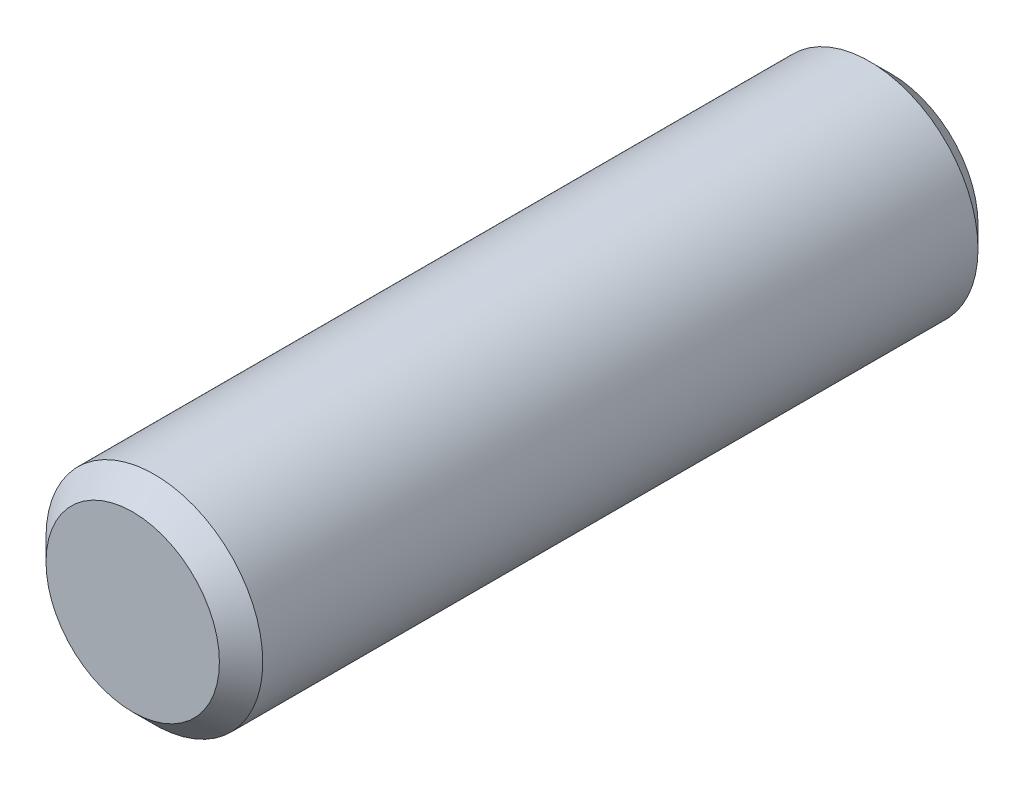
ISO-10303-21;
HEADER;
FILE_DESCRIPTION(('STEP AP214'),'2;1');
FILE_NAME('part.step','',(''),(''),'','','');
FILE_SCHEMA(('AUTOMOTIVE_DESIGN { 1 0 10303 214 1 1 1 1 }'));
ENDSEC;
DATA;
#1=APPLICATION_CONTEXT('core data for automotive mechanical design processes');
#2=APPLICATION_PROTOCOL_DEFINITION('international standard','automotive_design',2000,#1);
#3=PRODUCT_CONTEXT('',#1,'mechanical');
#4=PRODUCT('Part','Part','',(#3));
#5=PRODUCT_RELATED_PRODUCT_CATEGORY('part','',(#4));
#6=PRODUCT_DEFINITION_FORMATION('','',#4);
#7=PRODUCT_DEFINITION_CONTEXT('part definition',#1,'design');
#8=PRODUCT_DEFINITION('design','',#6,#7);
#9=PRODUCT_DEFINITION_SHAPE('','',#8);
#10=(LENGTH_UNIT() NAMED_UNIT(*) SI_UNIT(.MILLI.,.METRE.));
#11=(NAMED_UNIT(*) PLANE_ANGLE_UNIT() SI_UNIT($,.RADIAN.));
#12=(NAMED_UNIT(*) SI_UNIT($,.STERADIAN.) SOLID_ANGLE_UNIT());
#13=UNCERTAINTY_MEASURE_WITH_UNIT(LENGTH_MEASURE(1.E-05),#10,'distance_accuracy_value','');
#14=(GEOMETRIC_REPRESENTATION_CONTEXT(3) GLOBAL_UNCERTAINTY_ASSIGNED_CONTEXT((#13)) GLOBAL_UNIT_ASSIGNED_CONTEXT((#10,
#11,#12)) REPRESENTATION_CONTEXT('',''));
#15=CARTESIAN_POINT('',(0.,0.,0.));
#16=DIRECTION('',(0.,0.,1.));
#17=DIRECTION('',(1.,0.,0.));
#18=AXIS2_PLACEMENT_3D('',#15,#16,#17);
#19=CARTESIAN_POINT('',(0.,0.,35.));
#20=DIRECTION('',(0.,0.,-1.));
#21=DIRECTION('',(-1.,0.,0.));
#22=AXIS2_PLACEMENT_3D('',#19,#20,#21);
#23=CYLINDRICAL_SURFACE('',#22,10.);
#24=CARTESIAN_POINT('',(0.,0.,-33.));
#25=DIRECTION('',(0.,0.,1.));
#26=DIRECTION('',(1.,0.,0.));
#27=AXIS2_PLACEMENT_3D('',#24,#25,#26);
#28=CIRCLE('',#27,10.);
#29=CARTESIAN_POINT('',(10.,0.,-33.));
#30=VERTEX_POINT('',#29);
#31=EDGE_CURVE('E52',#30,#30,#28,.T.);
#32=ORIENTED_EDGE('',*,*,#31,.T.);
#33=EDGE_LOOP('',(#32));
#34=FACE_BOUND('',#33,.T.);
#35=CARTESIAN_POINT('',(0.,0.,33.));
#36=DIRECTION('',(0.,0.,1.));
#37=DIRECTION('',(1.,0.,0.));
#38=AXIS2_PLACEMENT_3D('',#35,#36,#37);
#39=CIRCLE('',#38,10.);
#40=CARTESIAN_POINT('',(10.,0.,33.));
#41=VERTEX_POINT('',#40);
#42=EDGE_CURVE('E57',#41,#41,#39,.F.);
#43=ORIENTED_EDGE('',*,*,#42,.T.);
#44=EDGE_LOOP('',(#43));
#45=FACE_BOUND('',#44,.T.);
#46=ADVANCED_FACE('F38',(#34,#45),#23,.T.);
#47=CARTESIAN_POINT('',(0.,0.,35.));
#48=DIRECTION('',(0.,0.,1.));
#49=DIRECTION('',(1.,0.,0.));
#50=AXIS2_PLACEMENT_3D('',#47,#48,#49);
#51=PLANE('',#50);
#52=CARTESIAN_POINT('',(0.,0.,35.));
#53=DIRECTION('',(0.,0.,1.));
#54=DIRECTION('',(1.,0.,0.));
#55=AXIS2_PLACEMENT_3D('',#52,#53,#54);
#56=CIRCLE('',#55,8.);
#57=CARTESIAN_POINT('',(8.,0.,35.));
#58=VERTEX_POINT('',#57);
#59=EDGE_CURVE('E10',#58,#58,#56,.T.);
#60=ORIENTED_EDGE('',*,*,#59,.T.);
#61=EDGE_LOOP('',(#60));
#62=FACE_BOUND('',#61,.T.);
#63=ADVANCED_FACE('F74',(#62),#51,.T.);
#64=CARTESIAN_POINT('',(0.,0.,-35.));
#65=DIRECTION('',(0.,0.,1.));
#66=DIRECTION('',(1.,0.,0.));
#67=AXIS2_PLACEMENT_3D('',#64,#65,#66);
#68=PLANE('',#67);
#69=CARTESIAN_POINT('',(0.,0.,-35.));
#70=DIRECTION('',(0.,0.,1.));
#71=DIRECTION('',(1.,0.,0.));
#72=AXIS2_PLACEMENT_3D('',#69,#70,#71);
#73=CIRCLE('',#72,7.99999999999999);
#74=CARTESIAN_POINT('',(7.99999999999999,0.,-35.));
#75=VERTEX_POINT('',#74);
#76=EDGE_CURVE('E47',#75,#75,#73,.F.);
#77=ORIENTED_EDGE('',*,*,#76,.T.);
#78=EDGE_LOOP('',(#77));
#79=FACE_BOUND('',#78,.T.);
#80=ADVANCED_FACE('F71',(#79),#68,.F.);
#81=CARTESIAN_POINT('',(0.,0.,-33.));
#82=DIRECTION('',(0.,0.,1.));
#83=DIRECTION('',(1.,0.,0.));
#84=AXIS2_PLACEMENT_3D('',#81,#82,#83);
#85=CONICAL_SURFACE('',#84,10.,0.785398163397451);
#86=ORIENTED_EDGE('',*,*,#76,.F.);
#87=EDGE_LOOP('',(#86));
#88=FACE_BOUND('',#87,.T.);
#89=ORIENTED_EDGE('',*,*,#31,.F.);
#90=EDGE_LOOP('',(#89));
#91=FACE_BOUND('',#90,.T.);
#92=ADVANCED_FACE('F67',(#88,#91),#85,.T.);
#93=CARTESIAN_POINT('',(0.,0.,35.));
#94=DIRECTION('',(0.,0.,-1.));
#95=DIRECTION('',(-1.,0.,0.));
#96=AXIS2_PLACEMENT_3D('',#93,#94,#95);
#97=CONICAL_SURFACE('',#96,8.,0.785398163397444);
#98=ORIENTED_EDGE('',*,*,#42,.F.);
#99=EDGE_LOOP('',(#98));
#100=FACE_BOUND('',#99,.T.);
#101=ORIENTED_EDGE('',*,*,#59,.F.);
#102=EDGE_LOOP('',(#101));
#103=FACE_BOUND('',#102,.T.);
#104=ADVANCED_FACE('F41',(#100,#103),#97,.T.);
#105=CLOSED_SHELL('',(#46,#63,#80,#92,#104));
#106=MANIFOLD_SOLID_BREP('B2',#105);
#107=ADVANCED_BREP_SHAPE_REPRESENTATION('',(#18,#106),#14);
#108=SHAPE_DEFINITION_REPRESENTATION(#9,#107);
ENDSEC;
END-ISO-10303-21;
